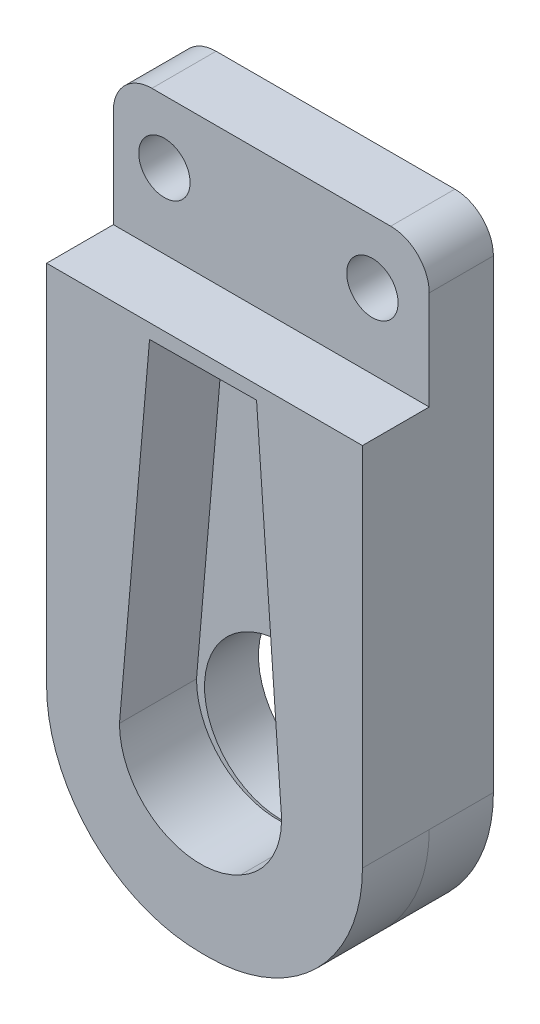
ISO-10303-21;
HEADER;
FILE_DESCRIPTION(('STEP AP214'),'2;1');
FILE_NAME('part.step','',(''),(''),'','','');
FILE_SCHEMA(('AUTOMOTIVE_DESIGN { 1 0 10303 214 1 1 1 1 }'));
ENDSEC;
DATA;
#1=APPLICATION_CONTEXT('core data for automotive mechanical design processes');
#2=APPLICATION_PROTOCOL_DEFINITION('international standard','automotive_design',2000,#1);
#3=PRODUCT_CONTEXT('',#1,'mechanical');
#4=PRODUCT('Part','Part','',(#3));
#5=PRODUCT_RELATED_PRODUCT_CATEGORY('part','',(#4));
#6=PRODUCT_DEFINITION_FORMATION('','',#4);
#7=PRODUCT_DEFINITION_CONTEXT('part definition',#1,'design');
#8=PRODUCT_DEFINITION('design','',#6,#7);
#9=PRODUCT_DEFINITION_SHAPE('','',#8);
#10=(LENGTH_UNIT() NAMED_UNIT(*) SI_UNIT(.MILLI.,.METRE.));
#11=(NAMED_UNIT(*) PLANE_ANGLE_UNIT() SI_UNIT($,.RADIAN.));
#12=(NAMED_UNIT(*) SI_UNIT($,.STERADIAN.) SOLID_ANGLE_UNIT());
#13=UNCERTAINTY_MEASURE_WITH_UNIT(LENGTH_MEASURE(1.E-05),#10,'distance_accuracy_value','');
#14=(GEOMETRIC_REPRESENTATION_CONTEXT(3) GLOBAL_UNCERTAINTY_ASSIGNED_CONTEXT((#13)) GLOBAL_UNIT_ASSIGNED_CONTEXT((#10,
#11,#12)) REPRESENTATION_CONTEXT('',''));
#15=CARTESIAN_POINT('',(0.,0.,0.));
#16=DIRECTION('',(0.,0.,1.));
#17=DIRECTION('',(1.,0.,0.));
#18=AXIS2_PLACEMENT_3D('',#15,#16,#17);
#19=CARTESIAN_POINT('',(-326.037234808109,240.363656002817,12.5));
#20=DIRECTION('',(1.,0.,0.));
#21=DIRECTION('',(0.,0.,-1.));
#22=AXIS2_PLACEMENT_3D('',#19,#20,#21);
#23=PLANE('',#22);
#24=DIRECTION('',(0.,0.,-1.));
#25=VECTOR('',#24,1.);
#26=CARTESIAN_POINT('',(-326.037234808109,220.763656002817,12.5));
#27=LINE('',#26,#25);
#28=CARTESIAN_POINT('',(-326.037234808109,220.763656002817,10.));
#29=VERTEX_POINT('',#28);
#30=CARTESIAN_POINT('',(-326.037234808109,220.763656002817,12.5));
#31=VERTEX_POINT('',#30);
#32=EDGE_CURVE('E239',#29,#31,#27,.F.);
#33=ORIENTED_EDGE('',*,*,#32,.T.);
#34=DIRECTION('',(0.,0.,-1.));
#35=VECTOR('',#34,1.);
#36=CARTESIAN_POINT('',(-326.037234808109,220.763656002817,12.5));
#37=LINE('',#36,#35);
#38=CARTESIAN_POINT('',(-326.037234808109,220.763656002817,15.1));
#39=VERTEX_POINT('',#38);
#40=EDGE_CURVE('E61',#31,#39,#37,.F.);
#41=ORIENTED_EDGE('',*,*,#40,.T.);
#42=DIRECTION('',(0.,-1.,0.));
#43=VECTOR('',#42,1.);
#44=CARTESIAN_POINT('',(-326.037234808109,235.015415168326,15.1));
#45=LINE('',#44,#43);
#46=CARTESIAN_POINT('',(-326.037234808109,235.015415168326,15.1));
#47=VERTEX_POINT('',#46);
#48=EDGE_CURVE('E290',#47,#39,#45,.T.);
#49=ORIENTED_EDGE('',*,*,#48,.F.);
#50=DIRECTION('',(0.,0.,-1.));
#51=VECTOR('',#50,1.);
#52=CARTESIAN_POINT('',(-326.037234808109,235.015415168326,15.1));
#53=LINE('',#52,#51);
#54=CARTESIAN_POINT('',(-326.037234808109,235.015415168326,12.5));
#55=VERTEX_POINT('',#54);
#56=EDGE_CURVE('E283',#47,#55,#53,.T.);
#57=ORIENTED_EDGE('',*,*,#56,.T.);
#58=DIRECTION('',(0.,-1.,0.));
#59=VECTOR('',#58,1.);
#60=CARTESIAN_POINT('',(-326.037234808109,240.363656002817,12.5));
#61=LINE('',#60,#59);
#62=CARTESIAN_POINT('',(-326.037234808109,238.863656002817,12.5));
#63=VERTEX_POINT('',#62);
#64=EDGE_CURVE('E262',#63,#55,#61,.T.);
#65=ORIENTED_EDGE('',*,*,#64,.F.);
#66=DIRECTION('',(0.,0.,-1.));
#67=VECTOR('',#66,1.);
#68=CARTESIAN_POINT('',(-326.037234808109,238.863656002817,12.5));
#69=LINE('',#68,#67);
#70=CARTESIAN_POINT('',(-326.037234808109,238.863656002817,10.));
#71=VERTEX_POINT('',#70);
#72=EDGE_CURVE('E236',#63,#71,#69,.T.);
#73=ORIENTED_EDGE('',*,*,#72,.T.);
#74=DIRECTION('',(0.,-1.,0.));
#75=VECTOR('',#74,1.);
#76=CARTESIAN_POINT('',(-326.037234808109,240.363656002817,10.));
#77=LINE('',#76,#75);
#78=EDGE_CURVE('E216',#71,#29,#77,.T.);
#79=ORIENTED_EDGE('',*,*,#78,.T.);
#80=EDGE_LOOP('',(#33,#41,#49,#57,#65,#73,#79));
#81=FACE_BOUND('',#80,.T.);
#82=ADVANCED_FACE('F36',(#81),#23,.F.);
#83=CARTESIAN_POINT('',(-326.037234808109,214.763656002817,12.5));
#84=DIRECTION('',(0.,1.,0.));
#85=DIRECTION('',(0.,0.,1.));
#86=AXIS2_PLACEMENT_3D('',#83,#84,#85);
#87=PLANE('',#86);
#88=DIRECTION('',(0.,0.,-1.));
#89=VECTOR('',#88,1.);
#90=CARTESIAN_POINT('',(-319.737234808109,214.763656002817,12.5));
#91=LINE('',#90,#89);
#92=CARTESIAN_POINT('',(-319.737234808109,214.763656002817,10.));
#93=VERTEX_POINT('',#92);
#94=CARTESIAN_POINT('',(-319.737234808109,214.763656002817,12.5));
#95=VERTEX_POINT('',#94);
#96=EDGE_CURVE('E245',#93,#95,#91,.F.);
#97=ORIENTED_EDGE('',*,*,#96,.T.);
#98=DIRECTION('',(0.,0.,-1.));
#99=VECTOR('',#98,1.);
#100=CARTESIAN_POINT('',(-319.737234808109,214.763656002817,12.5));
#101=LINE('',#100,#99);
#102=CARTESIAN_POINT('',(-319.737234808109,214.763656002817,15.1));
#103=VERTEX_POINT('',#102);
#104=EDGE_CURVE('E204',#95,#103,#101,.F.);
#105=ORIENTED_EDGE('',*,*,#104,.T.);
#106=DIRECTION('',(1.,0.,0.));
#107=VECTOR('',#106,1.);
#108=CARTESIAN_POINT('',(-326.037234808109,214.763656002817,15.1));
#109=LINE('',#108,#107);
#110=CARTESIAN_POINT('',(-320.037234808109,214.763656002817,15.1));
#111=VERTEX_POINT('',#110);
#112=EDGE_CURVE('E295',#111,#103,#109,.T.);
#113=ORIENTED_EDGE('',*,*,#112,.F.);
#114=DIRECTION('',(0.,0.,-1.));
#115=VECTOR('',#114,1.);
#116=CARTESIAN_POINT('',(-320.037234808109,214.763656002817,12.5));
#117=LINE('',#116,#115);
#118=CARTESIAN_POINT('',(-320.037234808109,214.763656002817,12.5));
#119=VERTEX_POINT('',#118);
#120=EDGE_CURVE('E206',#111,#119,#117,.T.);
#121=ORIENTED_EDGE('',*,*,#120,.T.);
#122=DIRECTION('',(0.,0.,-1.));
#123=VECTOR('',#122,1.);
#124=CARTESIAN_POINT('',(-320.037234808109,214.763656002817,12.5));
#125=LINE('',#124,#123);
#126=CARTESIAN_POINT('',(-320.037234808109,214.763656002817,10.));
#127=VERTEX_POINT('',#126);
#128=EDGE_CURVE('E247',#119,#127,#125,.T.);
#129=ORIENTED_EDGE('',*,*,#128,.T.);
#130=DIRECTION('',(1.,0.,0.));
#131=VECTOR('',#130,1.);
#132=CARTESIAN_POINT('',(-326.037234808109,214.763656002817,10.));
#133=LINE('',#132,#131);
#134=EDGE_CURVE('E266',#127,#93,#133,.T.);
#135=ORIENTED_EDGE('',*,*,#134,.T.);
#136=EDGE_LOOP('',(#97,#105,#113,#121,#129,#135));
#137=FACE_BOUND('',#136,.T.);
#138=ADVANCED_FACE('F365',(#137),#87,.F.);
#139=CARTESIAN_POINT('',(-313.737234808109,240.363656002817,12.5));
#140=DIRECTION('',(-1.,0.,0.));
#141=DIRECTION('',(0.,-1.,0.));
#142=AXIS2_PLACEMENT_3D('',#139,#140,#141);
#143=PLANE('',#142);
#144=DIRECTION('',(0.,1.,0.));
#145=VECTOR('',#144,1.);
#146=CARTESIAN_POINT('',(-313.737234808109,235.015415168326,15.1));
#147=LINE('',#146,#145);
#148=CARTESIAN_POINT('',(-313.737234808109,220.763656002817,15.1));
#149=VERTEX_POINT('',#148);
#150=CARTESIAN_POINT('',(-313.737234808109,235.015415168326,15.1));
#151=VERTEX_POINT('',#150);
#152=EDGE_CURVE('E293',#149,#151,#147,.T.);
#153=ORIENTED_EDGE('',*,*,#152,.F.);
#154=DIRECTION('',(0.,0.,-1.));
#155=VECTOR('',#154,1.);
#156=CARTESIAN_POINT('',(-313.737234808109,220.763656002817,12.5));
#157=LINE('',#156,#155);
#158=CARTESIAN_POINT('',(-313.737234808109,220.763656002817,12.5));
#159=VERTEX_POINT('',#158);
#160=EDGE_CURVE('E209',#149,#159,#157,.T.);
#161=ORIENTED_EDGE('',*,*,#160,.T.);
#162=DIRECTION('',(0.,0.,-1.));
#163=VECTOR('',#162,1.);
#164=CARTESIAN_POINT('',(-313.737234808109,220.763656002817,12.5));
#165=LINE('',#164,#163);
#166=CARTESIAN_POINT('',(-313.737234808109,220.763656002817,10.));
#167=VERTEX_POINT('',#166);
#168=EDGE_CURVE('E255',#159,#167,#165,.T.);
#169=ORIENTED_EDGE('',*,*,#168,.T.);
#170=DIRECTION('',(0.,1.,0.));
#171=VECTOR('',#170,1.);
#172=CARTESIAN_POINT('',(-313.737234808109,240.363656002817,10.));
#173=LINE('',#172,#171);
#174=CARTESIAN_POINT('',(-313.737234808109,238.863656002817,10.));
#175=VERTEX_POINT('',#174);
#176=EDGE_CURVE('E263',#167,#175,#173,.T.);
#177=ORIENTED_EDGE('',*,*,#176,.T.);
#178=DIRECTION('',(0.,0.,-1.));
#179=VECTOR('',#178,1.);
#180=CARTESIAN_POINT('',(-313.737234808109,238.863656002817,12.5));
#181=LINE('',#180,#179);
#182=CARTESIAN_POINT('',(-313.737234808109,238.863656002817,12.5));
#183=VERTEX_POINT('',#182);
#184=EDGE_CURVE('E212',#175,#183,#181,.F.);
#185=ORIENTED_EDGE('',*,*,#184,.T.);
#186=DIRECTION('',(0.,1.,0.));
#187=VECTOR('',#186,1.);
#188=CARTESIAN_POINT('',(-313.737234808109,240.363656002817,12.5));
#189=LINE('',#188,#187);
#190=CARTESIAN_POINT('',(-313.737234808109,235.015415168326,12.5));
#191=VERTEX_POINT('',#190);
#192=EDGE_CURVE('E272',#191,#183,#189,.T.);
#193=ORIENTED_EDGE('',*,*,#192,.F.);
#194=DIRECTION('',(0.,0.,-1.));
#195=VECTOR('',#194,1.);
#196=CARTESIAN_POINT('',(-313.737234808109,235.015415168326,15.1));
#197=LINE('',#196,#195);
#198=EDGE_CURVE('E278',#151,#191,#197,.T.);
#199=ORIENTED_EDGE('',*,*,#198,.F.);
#200=EDGE_LOOP('',(#153,#161,#169,#177,#185,#193,#199));
#201=FACE_BOUND('',#200,.T.);
#202=ADVANCED_FACE('F357',(#201),#143,.F.);
#203=CARTESIAN_POINT('',(-326.037234808109,240.363656002817,12.5));
#204=DIRECTION('',(0.,-1.,0.));
#205=DIRECTION('',(0.,0.,-1.));
#206=AXIS2_PLACEMENT_3D('',#203,#204,#205);
#207=PLANE('',#206);
#208=DIRECTION('',(-1.,0.,0.));
#209=VECTOR('',#208,1.);
#210=CARTESIAN_POINT('',(-326.037234808109,240.363656002817,10.));
#211=LINE('',#210,#209);
#212=CARTESIAN_POINT('',(-315.237234808109,240.363656002817,10.));
#213=VERTEX_POINT('',#212);
#214=CARTESIAN_POINT('',(-324.537234808109,240.363656002817,10.));
#215=VERTEX_POINT('',#214);
#216=EDGE_CURVE('E259',#213,#215,#211,.T.);
#217=ORIENTED_EDGE('',*,*,#216,.T.);
#218=DIRECTION('',(0.,0.,-1.));
#219=VECTOR('',#218,1.);
#220=CARTESIAN_POINT('',(-324.537234808109,240.363656002817,12.5));
#221=LINE('',#220,#219);
#222=CARTESIAN_POINT('',(-324.537234808109,240.363656002817,12.5));
#223=VERTEX_POINT('',#222);
#224=EDGE_CURVE('E227',#215,#223,#221,.F.);
#225=ORIENTED_EDGE('',*,*,#224,.T.);
#226=DIRECTION('',(-1.,0.,0.));
#227=VECTOR('',#226,1.);
#228=CARTESIAN_POINT('',(-326.037234808109,240.363656002817,12.5));
#229=LINE('',#228,#227);
#230=CARTESIAN_POINT('',(-315.237234808109,240.363656002817,12.5));
#231=VERTEX_POINT('',#230);
#232=EDGE_CURVE('E258',#231,#223,#229,.T.);
#233=ORIENTED_EDGE('',*,*,#232,.F.);
#234=DIRECTION('',(0.,0.,-1.));
#235=VECTOR('',#234,1.);
#236=CARTESIAN_POINT('',(-315.237234808109,240.363656002817,12.5));
#237=LINE('',#236,#235);
#238=EDGE_CURVE('E229',#231,#213,#237,.T.);
#239=ORIENTED_EDGE('',*,*,#238,.T.);
#240=EDGE_LOOP('',(#217,#225,#233,#239));
#241=FACE_BOUND('',#240,.T.);
#242=ADVANCED_FACE('F345',(#241),#207,.F.);
#243=CARTESIAN_POINT('',(0.,0.,12.5));
#244=DIRECTION('',(0.,0.,1.));
#245=DIRECTION('',(1.,0.,0.));
#246=AXIS2_PLACEMENT_3D('',#243,#244,#245);
#247=PLANE('',#246);
#248=DIRECTION('',(-1.,0.,0.));
#249=VECTOR('',#248,1.);
#250=CARTESIAN_POINT('',(-326.037234808109,235.015415168326,12.5));
#251=LINE('',#250,#249);
#252=EDGE_CURVE('E287',#191,#55,#251,.T.);
#253=ORIENTED_EDGE('',*,*,#252,.F.);
#254=ORIENTED_EDGE('',*,*,#192,.T.);
#255=CARTESIAN_POINT('',(-315.237234808109,238.863656002817,12.5));
#256=DIRECTION('',(0.,0.,1.));
#257=DIRECTION('',(1.,0.,0.));
#258=AXIS2_PLACEMENT_3D('',#255,#256,#257);
#259=CIRCLE('',#258,1.5);
#260=EDGE_CURVE('E225',#183,#231,#259,.T.);
#261=ORIENTED_EDGE('',*,*,#260,.T.);
#262=ORIENTED_EDGE('',*,*,#232,.T.);
#263=CARTESIAN_POINT('',(-324.537234808109,238.863656002817,12.5));
#264=DIRECTION('',(0.,0.,1.));
#265=DIRECTION('',(1.,0.,0.));
#266=AXIS2_PLACEMENT_3D('',#263,#264,#265);
#267=CIRCLE('',#266,1.5);
#268=EDGE_CURVE('E223',#223,#63,#267,.T.);
#269=ORIENTED_EDGE('',*,*,#268,.T.);
#270=ORIENTED_EDGE('',*,*,#64,.T.);
#271=EDGE_LOOP('',(#253,#254,#261,#262,#269,#270));
#272=FACE_BOUND('',#271,.T.);
#273=CARTESIAN_POINT('',(-324.049090595756,237.922314015465,12.5));
#274=DIRECTION('',(0.,0.,1.));
#275=DIRECTION('',(1.,0.,0.));
#276=AXIS2_PLACEMENT_3D('',#273,#274,#275);
#277=CIRCLE('',#276,0.999999999999998);
#278=CARTESIAN_POINT('',(-323.049090595756,237.922314015465,12.5));
#279=VERTEX_POINT('',#278);
#280=EDGE_CURVE('E220',#279,#279,#277,.T.);
#281=ORIENTED_EDGE('',*,*,#280,.F.);
#282=EDGE_LOOP('',(#281));
#283=FACE_BOUND('',#282,.T.);
#284=CARTESIAN_POINT('',(-315.949090595756,237.922314015465,12.5));
#285=DIRECTION('',(0.,0.,1.));
#286=DIRECTION('',(1.,0.,0.));
#287=AXIS2_PLACEMENT_3D('',#284,#285,#286);
#288=CIRCLE('',#287,0.999999999999998);
#289=CARTESIAN_POINT('',(-314.949090595756,237.922314015465,12.5));
#290=VERTEX_POINT('',#289);
#291=EDGE_CURVE('E275',#290,#290,#288,.T.);
#292=ORIENTED_EDGE('',*,*,#291,.F.);
#293=EDGE_LOOP('',(#292));
#294=FACE_BOUND('',#293,.T.);
#295=ADVANCED_FACE('F326',(#272,#283,#294),#247,.T.);
#296=CARTESIAN_POINT('',(0.,0.,10.));
#297=DIRECTION('',(0.,0.,1.));
#298=DIRECTION('',(1.,0.,0.));
#299=AXIS2_PLACEMENT_3D('',#296,#297,#298);
#300=PLANE('',#299);
#301=CARTESIAN_POINT('',(-319.887234808109,220.812052897843,10.));
#302=DIRECTION('',(0.,0.,1.));
#303=DIRECTION('',(1.,0.,0.));
#304=AXIS2_PLACEMENT_3D('',#301,#302,#303);
#305=CIRCLE('',#304,2.99999999999999);
#306=CARTESIAN_POINT('',(-316.887234808109,220.812052897843,10.));
#307=VERTEX_POINT('',#306);
#308=EDGE_CURVE('E291',#307,#307,#305,.T.);
#309=ORIENTED_EDGE('',*,*,#308,.T.);
#310=EDGE_LOOP('',(#309));
#311=FACE_BOUND('',#310,.T.);
#312=CARTESIAN_POINT('',(-324.049090595756,237.922314015465,10.));
#313=DIRECTION('',(0.,0.,1.));
#314=DIRECTION('',(1.,0.,0.));
#315=AXIS2_PLACEMENT_3D('',#312,#313,#314);
#316=CIRCLE('',#315,0.999999999999998);
#317=CARTESIAN_POINT('',(-323.049090595756,237.922314015465,10.));
#318=VERTEX_POINT('',#317);
#319=EDGE_CURVE('E213',#318,#318,#316,.T.);
#320=ORIENTED_EDGE('',*,*,#319,.T.);
#321=EDGE_LOOP('',(#320));
#322=FACE_BOUND('',#321,.T.);
#323=CARTESIAN_POINT('',(-315.949090595756,237.922314015465,10.));
#324=DIRECTION('',(0.,0.,1.));
#325=DIRECTION('',(1.,0.,0.));
#326=AXIS2_PLACEMENT_3D('',#323,#324,#325);
#327=CIRCLE('',#326,0.999999999999998);
#328=CARTESIAN_POINT('',(-314.949090595756,237.922314015465,10.));
#329=VERTEX_POINT('',#328);
#330=EDGE_CURVE('E217',#329,#329,#327,.T.);
#331=ORIENTED_EDGE('',*,*,#330,.T.);
#332=EDGE_LOOP('',(#331));
#333=FACE_BOUND('',#332,.T.);
#334=ORIENTED_EDGE('',*,*,#78,.F.);
#335=CARTESIAN_POINT('',(-324.537234808109,238.863656002817,10.));
#336=DIRECTION('',(0.,0.,1.));
#337=DIRECTION('',(1.,0.,0.));
#338=AXIS2_PLACEMENT_3D('',#335,#336,#337);
#339=CIRCLE('',#338,1.5);
#340=EDGE_CURVE('E232',#71,#215,#339,.F.);
#341=ORIENTED_EDGE('',*,*,#340,.T.);
#342=ORIENTED_EDGE('',*,*,#216,.F.);
#343=CARTESIAN_POINT('',(-315.237234808109,238.863656002817,10.));
#344=DIRECTION('',(0.,0.,1.));
#345=DIRECTION('',(1.,0.,0.));
#346=AXIS2_PLACEMENT_3D('',#343,#344,#345);
#347=CIRCLE('',#346,1.5);
#348=EDGE_CURVE('E234',#213,#175,#347,.F.);
#349=ORIENTED_EDGE('',*,*,#348,.T.);
#350=ORIENTED_EDGE('',*,*,#176,.F.);
#351=CARTESIAN_POINT('',(-319.737234808109,220.763656002817,10.));
#352=DIRECTION('',(0.,0.,1.));
#353=DIRECTION('',(1.,0.,0.));
#354=AXIS2_PLACEMENT_3D('',#351,#352,#353);
#355=CIRCLE('',#354,6.);
#356=EDGE_CURVE('E250',#167,#93,#355,.F.);
#357=ORIENTED_EDGE('',*,*,#356,.T.);
#358=ORIENTED_EDGE('',*,*,#134,.F.);
#359=CARTESIAN_POINT('',(-320.037234808109,220.763656002817,10.));
#360=DIRECTION('',(0.,0.,1.));
#361=DIRECTION('',(1.,0.,0.));
#362=AXIS2_PLACEMENT_3D('',#359,#360,#361);
#363=CIRCLE('',#362,6.);
#364=EDGE_CURVE('E252',#127,#29,#363,.F.);
#365=ORIENTED_EDGE('',*,*,#364,.T.);
#366=EDGE_LOOP('',(#334,#341,#342,#349,#350,#357,#358,#365));
#367=FACE_BOUND('',#366,.T.);
#368=ADVANCED_FACE('F322',(#311,#322,#333,#367),#300,.F.);
#369=CARTESIAN_POINT('',(-319.737234808109,220.763656002817,12.5));
#370=DIRECTION('',(0.,0.,-1.));
#371=DIRECTION('',(-1.,0.,0.));
#372=AXIS2_PLACEMENT_3D('',#369,#370,#371);
#373=CYLINDRICAL_SURFACE('',#372,6.);
#374=CARTESIAN_POINT('',(-319.737234808109,220.763656002817,12.5));
#375=DIRECTION('',(0.,0.,1.));
#376=DIRECTION('',(1.,0.,0.));
#377=AXIS2_PLACEMENT_3D('',#374,#375,#376);
#378=CIRCLE('',#377,6.);
#379=EDGE_CURVE('E241',#95,#159,#378,.T.);
#380=ORIENTED_EDGE('',*,*,#379,.F.);
#381=ORIENTED_EDGE('',*,*,#96,.F.);
#382=ORIENTED_EDGE('',*,*,#356,.F.);
#383=ORIENTED_EDGE('',*,*,#168,.F.);
#384=EDGE_LOOP('',(#380,#381,#382,#383));
#385=FACE_BOUND('',#384,.T.);
#386=ADVANCED_FACE('F325',(#385),#373,.T.);
#387=CARTESIAN_POINT('',(-320.037234808109,220.763656002817,12.5));
#388=DIRECTION('',(0.,0.,-1.));
#389=DIRECTION('',(-1.,0.,0.));
#390=AXIS2_PLACEMENT_3D('',#387,#388,#389);
#391=CYLINDRICAL_SURFACE('',#390,6.);
#392=CARTESIAN_POINT('',(-320.037234808109,220.763656002817,12.5));
#393=DIRECTION('',(0.,0.,1.));
#394=DIRECTION('',(1.,0.,0.));
#395=AXIS2_PLACEMENT_3D('',#392,#393,#394);
#396=CIRCLE('',#395,6.);
#397=EDGE_CURVE('E243',#31,#119,#396,.T.);
#398=ORIENTED_EDGE('',*,*,#397,.F.);
#399=ORIENTED_EDGE('',*,*,#32,.F.);
#400=ORIENTED_EDGE('',*,*,#364,.F.);
#401=ORIENTED_EDGE('',*,*,#128,.F.);
#402=EDGE_LOOP('',(#398,#399,#400,#401));
#403=FACE_BOUND('',#402,.T.);
#404=ADVANCED_FACE('F370',(#403),#391,.T.);
#405=CARTESIAN_POINT('',(-324.537234808109,238.863656002817,12.5));
#406=DIRECTION('',(0.,0.,-1.));
#407=DIRECTION('',(-1.,0.,0.));
#408=AXIS2_PLACEMENT_3D('',#405,#406,#407);
#409=CYLINDRICAL_SURFACE('',#408,1.5);
#410=ORIENTED_EDGE('',*,*,#268,.F.);
#411=ORIENTED_EDGE('',*,*,#224,.F.);
#412=ORIENTED_EDGE('',*,*,#340,.F.);
#413=ORIENTED_EDGE('',*,*,#72,.F.);
#414=EDGE_LOOP('',(#410,#411,#412,#413));
#415=FACE_BOUND('',#414,.T.);
#416=ADVANCED_FACE('F341',(#415),#409,.T.);
#417=CARTESIAN_POINT('',(-315.237234808109,238.863656002817,12.5));
#418=DIRECTION('',(0.,0.,-1.));
#419=DIRECTION('',(-1.,0.,0.));
#420=AXIS2_PLACEMENT_3D('',#417,#418,#419);
#421=CYLINDRICAL_SURFACE('',#420,1.5);
#422=ORIENTED_EDGE('',*,*,#260,.F.);
#423=ORIENTED_EDGE('',*,*,#184,.F.);
#424=ORIENTED_EDGE('',*,*,#348,.F.);
#425=ORIENTED_EDGE('',*,*,#238,.F.);
#426=EDGE_LOOP('',(#422,#423,#424,#425));
#427=FACE_BOUND('',#426,.T.);
#428=ADVANCED_FACE('F353',(#427),#421,.T.);
#429=CARTESIAN_POINT('',(-315.949090595756,237.922314015465,9.));
#430=DIRECTION('',(0.,0.,1.));
#431=DIRECTION('',(1.,0.,0.));
#432=AXIS2_PLACEMENT_3D('',#429,#430,#431);
#433=CYLINDRICAL_SURFACE('',#432,0.999999999999998);
#434=ORIENTED_EDGE('',*,*,#291,.T.);
#435=EDGE_LOOP('',(#434));
#436=FACE_BOUND('',#435,.T.);
#437=ORIENTED_EDGE('',*,*,#330,.F.);
#438=EDGE_LOOP('',(#437));
#439=FACE_BOUND('',#438,.T.);
#440=ADVANCED_FACE('F389',(#436,#439),#433,.F.);
#441=CARTESIAN_POINT('',(-324.049090595756,237.922314015465,9.));
#442=DIRECTION('',(0.,0.,1.));
#443=DIRECTION('',(1.,0.,0.));
#444=AXIS2_PLACEMENT_3D('',#441,#442,#443);
#445=CYLINDRICAL_SURFACE('',#444,0.999999999999998);
#446=ORIENTED_EDGE('',*,*,#280,.T.);
#447=EDGE_LOOP('',(#446));
#448=FACE_BOUND('',#447,.T.);
#449=ORIENTED_EDGE('',*,*,#319,.F.);
#450=EDGE_LOOP('',(#449));
#451=FACE_BOUND('',#450,.T.);
#452=ADVANCED_FACE('F382',(#448,#451),#445,.F.);
#453=CARTESIAN_POINT('',(-326.037234808109,235.015415168326,15.1));
#454=DIRECTION('',(0.,-1.,0.));
#455=DIRECTION('',(0.,0.,-1.));
#456=AXIS2_PLACEMENT_3D('',#453,#454,#455);
#457=PLANE('',#456);
#458=ORIENTED_EDGE('',*,*,#252,.T.);
#459=ORIENTED_EDGE('',*,*,#56,.F.);
#460=DIRECTION('',(-1.,0.,0.));
#461=VECTOR('',#460,1.);
#462=CARTESIAN_POINT('',(-326.037234808109,235.015415168326,15.1));
#463=LINE('',#462,#461);
#464=EDGE_CURVE('E286',#151,#47,#463,.T.);
#465=ORIENTED_EDGE('',*,*,#464,.F.);
#466=ORIENTED_EDGE('',*,*,#198,.T.);
#467=EDGE_LOOP('',(#458,#459,#465,#466));
#468=FACE_BOUND('',#467,.T.);
#469=ADVANCED_FACE('F380',(#468),#457,.F.);
#470=CARTESIAN_POINT('',(0.,0.,15.1));
#471=DIRECTION('',(0.,0.,1.));
#472=DIRECTION('',(1.,0.,0.));
#473=AXIS2_PLACEMENT_3D('',#470,#471,#472);
#474=PLANE('',#473);
#475=DIRECTION('',(-0.0714126800062966,0.997446855293212,0.));
#476=VECTOR('',#475,1.);
#477=CARTESIAN_POINT('',(-317.861572265625,234.48600769043,15.1));
#478=LINE('',#477,#476);
#479=CARTESIAN_POINT('',(-316.907505388101,221.160208873723,15.1));
#480=VERTEX_POINT('',#479);
#481=CARTESIAN_POINT('',(-317.861572265625,234.48600769043,15.1));
#482=VERTEX_POINT('',#481);
#483=EDGE_CURVE('E181',#480,#482,#478,.T.);
#484=ORIENTED_EDGE('',*,*,#483,.F.);
#485=CARTESIAN_POINT('',(-319.887234808109,220.812052897843,15.1));
#486=DIRECTION('',(0.,0.,1.));
#487=DIRECTION('',(1.,0.,0.));
#488=AXIS2_PLACEMENT_3D('',#485,#486,#487);
#489=CIRCLE('',#488,2.99999999999999);
#490=CARTESIAN_POINT('',(-318.483376089964,218.160792688152,15.1));
#491=VERTEX_POINT('',#490);
#492=EDGE_CURVE('E191',#491,#480,#489,.T.);
#493=ORIENTED_EDGE('',*,*,#492,.F.);
#494=CARTESIAN_POINT('',(-320.043758733238,220.90346779848,15.1));
#495=DIRECTION('',(0.,0.,1.));
#496=DIRECTION('',(1.,0.,0.));
#497=AXIS2_PLACEMENT_3D('',#494,#495,#496);
#498=CIRCLE('',#497,3.15548106542371);
#499=CARTESIAN_POINT('',(-323.19921875,220.914993286133,15.1));
#500=VERTEX_POINT('',#499);
#501=EDGE_CURVE('E186',#500,#491,#498,.T.);
#502=ORIENTED_EDGE('',*,*,#501,.F.);
#503=DIRECTION('',(-0.0862009122202304,-0.996277773882565,0.));
#504=VECTOR('',#503,1.);
#505=CARTESIAN_POINT('',(-322.028238528826,234.448742964222,15.1));
#506=LINE('',#505,#504);
#507=CARTESIAN_POINT('',(-322.028238528826,234.448742964222,15.1));
#508=VERTEX_POINT('',#507);
#509=EDGE_CURVE('E164',#508,#500,#506,.T.);
#510=ORIENTED_EDGE('',*,*,#509,.F.);
#511=DIRECTION('',(-0.999960008988507,-0.0089431774948453,0.));
#512=VECTOR('',#511,1.);
#513=CARTESIAN_POINT('',(-322.028238528826,234.448742964222,15.1));
#514=LINE('',#513,#512);
#515=EDGE_CURVE('E178',#482,#508,#514,.T.);
#516=ORIENTED_EDGE('',*,*,#515,.F.);
#517=EDGE_LOOP('',(#484,#493,#502,#510,#516));
#518=FACE_BOUND('',#517,.T.);
#519=ORIENTED_EDGE('',*,*,#112,.T.);
#520=CARTESIAN_POINT('',(-319.737234808109,220.763656002817,15.1));
#521=DIRECTION('',(0.,0.,1.));
#522=DIRECTION('',(1.,0.,0.));
#523=AXIS2_PLACEMENT_3D('',#520,#521,#522);
#524=CIRCLE('',#523,6.);
#525=EDGE_CURVE('E200',#103,#149,#524,.T.);
#526=ORIENTED_EDGE('',*,*,#525,.T.);
#527=ORIENTED_EDGE('',*,*,#152,.T.);
#528=ORIENTED_EDGE('',*,*,#464,.T.);
#529=ORIENTED_EDGE('',*,*,#48,.T.);
#530=CARTESIAN_POINT('',(-320.037234808109,220.763656002817,15.1));
#531=DIRECTION('',(0.,0.,1.));
#532=DIRECTION('',(1.,0.,0.));
#533=AXIS2_PLACEMENT_3D('',#530,#531,#532);
#534=CIRCLE('',#533,6.);
#535=EDGE_CURVE('E202',#39,#111,#534,.T.);
#536=ORIENTED_EDGE('',*,*,#535,.T.);
#537=EDGE_LOOP('',(#519,#526,#527,#528,#529,#536));
#538=FACE_BOUND('',#537,.T.);
#539=ADVANCED_FACE('F313',(#518,#538),#474,.T.);
#540=CARTESIAN_POINT('',(-319.737234808109,220.763656002817,12.5));
#541=DIRECTION('',(0.,0.,-1.));
#542=DIRECTION('',(-1.,0.,0.));
#543=AXIS2_PLACEMENT_3D('',#540,#541,#542);
#544=CYLINDRICAL_SURFACE('',#543,6.);
#545=ORIENTED_EDGE('',*,*,#525,.F.);
#546=ORIENTED_EDGE('',*,*,#104,.F.);
#547=ORIENTED_EDGE('',*,*,#379,.T.);
#548=ORIENTED_EDGE('',*,*,#160,.F.);
#549=EDGE_LOOP('',(#545,#546,#547,#548));
#550=FACE_BOUND('',#549,.T.);
#551=ADVANCED_FACE('F375',(#550),#544,.T.);
#552=CARTESIAN_POINT('',(-320.037234808109,220.763656002817,12.5));
#553=DIRECTION('',(0.,0.,-1.));
#554=DIRECTION('',(-1.,0.,0.));
#555=AXIS2_PLACEMENT_3D('',#552,#553,#554);
#556=CYLINDRICAL_SURFACE('',#555,6.);
#557=ORIENTED_EDGE('',*,*,#535,.F.);
#558=ORIENTED_EDGE('',*,*,#40,.F.);
#559=ORIENTED_EDGE('',*,*,#397,.T.);
#560=ORIENTED_EDGE('',*,*,#120,.F.);
#561=EDGE_LOOP('',(#557,#558,#559,#560));
#562=FACE_BOUND('',#561,.T.);
#563=ADVANCED_FACE('F38',(#562),#556,.T.);
#564=CARTESIAN_POINT('',(-319.887234808109,220.812052897843,10.));
#565=DIRECTION('',(0.,0.,1.));
#566=DIRECTION('',(1.,0.,0.));
#567=AXIS2_PLACEMENT_3D('',#564,#565,#566);
#568=CYLINDRICAL_SURFACE('',#567,2.99999999999999);
#569=DIRECTION('',(0.,0.,1.));
#570=VECTOR('',#569,1.);
#571=CARTESIAN_POINT('',(-316.907505388101,221.160208873723,10.));
#572=LINE('',#571,#570);
#573=CARTESIAN_POINT('',(-316.907505388101,221.160208873723,12.1));
#574=VERTEX_POINT('',#573);
#575=EDGE_CURVE('E11',#480,#574,#572,.F.);
#576=ORIENTED_EDGE('',*,*,#575,.T.);
#577=CARTESIAN_POINT('',(-319.887234808109,220.812052897843,12.1));
#578=DIRECTION('',(0.,0.,1.));
#579=DIRECTION('',(1.,0.,0.));
#580=AXIS2_PLACEMENT_3D('',#577,#578,#579);
#581=CIRCLE('',#580,2.99999999999999);
#582=CARTESIAN_POINT('',(-318.483376089964,218.160792688152,12.1));
#583=VERTEX_POINT('',#582);
#584=EDGE_CURVE('E40',#583,#574,#581,.F.);
#585=ORIENTED_EDGE('',*,*,#584,.F.);
#586=DIRECTION('',(0.,0.,1.));
#587=VECTOR('',#586,1.);
#588=CARTESIAN_POINT('',(-318.483376089964,218.160792688152,13.6));
#589=LINE('',#588,#587);
#590=EDGE_CURVE('E46',#583,#491,#589,.T.);
#591=ORIENTED_EDGE('',*,*,#590,.T.);
#592=ORIENTED_EDGE('',*,*,#492,.T.);
#593=EDGE_LOOP('',(#576,#585,#591,#592));
#594=FACE_BOUND('',#593,.T.);
#595=ORIENTED_EDGE('',*,*,#308,.F.);
#596=EDGE_LOOP('',(#595));
#597=FACE_BOUND('',#596,.T.);
#598=ADVANCED_FACE('F316',(#594,#597),#568,.F.);
#599=CARTESIAN_POINT('',(-317.861572265625,234.48600769043,12.1));
#600=DIRECTION('',(0.997446855293212,0.0714126800062966,0.));
#601=DIRECTION('',(-0.0714126800062966,0.997446855293212,0.));
#602=AXIS2_PLACEMENT_3D('',#599,#600,#601);
#603=PLANE('',#602);
#604=ORIENTED_EDGE('',*,*,#483,.T.);
#605=DIRECTION('',(0.,0.,1.));
#606=VECTOR('',#605,1.);
#607=CARTESIAN_POINT('',(-317.861572265625,234.48600769043,12.1));
#608=LINE('',#607,#606);
#609=CARTESIAN_POINT('',(-317.861572265625,234.48600769043,12.1));
#610=VERTEX_POINT('',#609);
#611=EDGE_CURVE('E168',#610,#482,#608,.T.);
#612=ORIENTED_EDGE('',*,*,#611,.F.);
#613=DIRECTION('',(-0.0714126800062966,0.997446855293212,0.));
#614=VECTOR('',#613,1.);
#615=CARTESIAN_POINT('',(-317.861572265625,234.48600769043,12.1));
#616=LINE('',#615,#614);
#617=EDGE_CURVE('E174',#574,#610,#616,.T.);
#618=ORIENTED_EDGE('',*,*,#617,.F.);
#619=ORIENTED_EDGE('',*,*,#575,.F.);
#620=EDGE_LOOP('',(#604,#612,#618,#619));
#621=FACE_BOUND('',#620,.T.);
#622=ADVANCED_FACE('F307',(#621),#603,.F.);
#623=CARTESIAN_POINT('',(-320.043758733238,220.90346779848,12.1));
#624=DIRECTION('',(0.,0.,1.));
#625=DIRECTION('',(1.,0.,0.));
#626=AXIS2_PLACEMENT_3D('',#623,#624,#625);
#627=CYLINDRICAL_SURFACE('',#626,3.15548106542371);
#628=CARTESIAN_POINT('',(-320.043758733238,220.90346779848,12.1));
#629=DIRECTION('',(0.,0.,1.));
#630=DIRECTION('',(1.,0.,0.));
#631=AXIS2_PLACEMENT_3D('',#628,#629,#630);
#632=CIRCLE('',#631,3.15548106542371);
#633=CARTESIAN_POINT('',(-323.19921875,220.914993286133,12.1));
#634=VERTEX_POINT('',#633);
#635=EDGE_CURVE('E53',#634,#583,#632,.T.);
#636=ORIENTED_EDGE('',*,*,#635,.F.);
#637=DIRECTION('',(0.,0.,1.));
#638=VECTOR('',#637,1.);
#639=CARTESIAN_POINT('',(-323.19921875,220.914993286133,12.1));
#640=LINE('',#639,#638);
#641=EDGE_CURVE('E159',#634,#500,#640,.T.);
#642=ORIENTED_EDGE('',*,*,#641,.T.);
#643=ORIENTED_EDGE('',*,*,#501,.T.);
#644=ORIENTED_EDGE('',*,*,#590,.F.);
#645=EDGE_LOOP('',(#636,#642,#643,#644));
#646=FACE_BOUND('',#645,.T.);
#647=ADVANCED_FACE('F171',(#646),#627,.F.);
#648=CARTESIAN_POINT('',(-320.043758733238,220.90346779848,12.1));
#649=DIRECTION('',(0.,0.,1.));
#650=DIRECTION('',(1.,0.,0.));
#651=AXIS2_PLACEMENT_3D('',#648,#649,#650);
#652=PLANE('',#651);
#653=ORIENTED_EDGE('',*,*,#584,.T.);
#654=ORIENTED_EDGE('',*,*,#617,.T.);
#655=DIRECTION('',(-0.999960008988507,-0.0089431774948453,0.));
#656=VECTOR('',#655,1.);
#657=CARTESIAN_POINT('',(-322.028238528826,234.448742964222,12.1));
#658=LINE('',#657,#656);
#659=CARTESIAN_POINT('',(-322.028238528826,234.448742964222,12.1));
#660=VERTEX_POINT('',#659);
#661=EDGE_CURVE('E169',#610,#660,#658,.T.);
#662=ORIENTED_EDGE('',*,*,#661,.T.);
#663=DIRECTION('',(-0.0862009122202304,-0.996277773882565,0.));
#664=VECTOR('',#663,1.);
#665=CARTESIAN_POINT('',(-322.028238528826,234.448742964222,12.1));
#666=LINE('',#665,#664);
#667=EDGE_CURVE('E161',#660,#634,#666,.T.);
#668=ORIENTED_EDGE('',*,*,#667,.T.);
#669=ORIENTED_EDGE('',*,*,#635,.T.);
#670=EDGE_LOOP('',(#653,#654,#662,#668,#669));
#671=FACE_BOUND('',#670,.T.);
#672=ADVANCED_FACE('F176',(#671),#652,.T.);
#673=CARTESIAN_POINT('',(-322.028238528826,234.448742964222,12.1));
#674=DIRECTION('',(-0.996277773882565,0.0862009122202304,0.));
#675=DIRECTION('',(-0.0862009122202304,-0.996277773882565,0.));
#676=AXIS2_PLACEMENT_3D('',#673,#674,#675);
#677=PLANE('',#676);
#678=ORIENTED_EDGE('',*,*,#509,.T.);
#679=ORIENTED_EDGE('',*,*,#641,.F.);
#680=ORIENTED_EDGE('',*,*,#667,.F.);
#681=DIRECTION('',(0.,0.,1.));
#682=VECTOR('',#681,1.);
#683=CARTESIAN_POINT('',(-322.028238528826,234.448742964222,12.1));
#684=LINE('',#683,#682);
#685=EDGE_CURVE('E189',#660,#508,#684,.T.);
#686=ORIENTED_EDGE('',*,*,#685,.T.);
#687=EDGE_LOOP('',(#678,#679,#680,#686));
#688=FACE_BOUND('',#687,.T.);
#689=ADVANCED_FACE('F160',(#688),#677,.F.);
#690=CARTESIAN_POINT('',(-322.028238528826,234.448742964222,12.1));
#691=DIRECTION('',(-0.0089431774948453,0.999960008988507,0.));
#692=DIRECTION('',(-0.999960008988507,-0.0089431774948453,0.));
#693=AXIS2_PLACEMENT_3D('',#690,#691,#692);
#694=PLANE('',#693);
#695=ORIENTED_EDGE('',*,*,#515,.T.);
#696=ORIENTED_EDGE('',*,*,#685,.F.);
#697=ORIENTED_EDGE('',*,*,#661,.F.);
#698=ORIENTED_EDGE('',*,*,#611,.T.);
#699=EDGE_LOOP('',(#695,#696,#697,#698));
#700=FACE_BOUND('',#699,.T.);
#701=ADVANCED_FACE('F311',(#700),#694,.F.);
#702=CLOSED_SHELL('',(#82,#138,#202,#242,#295,#368,#386,#404,#416,#428,#440,#452,#469,#539,#551,
#563,#598,#622,#647,#672,#689,#701));
#703=MANIFOLD_SOLID_BREP('B2',#702);
#704=ADVANCED_BREP_SHAPE_REPRESENTATION('',(#18,#703),#14);
#705=SHAPE_DEFINITION_REPRESENTATION(#9,#704);
ENDSEC;
END-ISO-10303-21;
